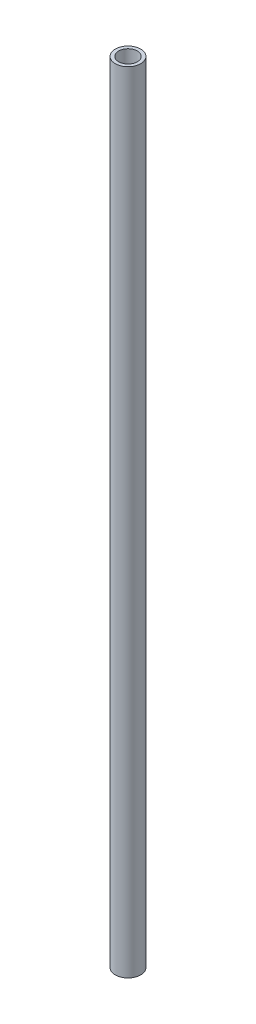
ISO-10303-21;
HEADER;
FILE_DESCRIPTION(('STEP AP214'),'2;1');
FILE_NAME('part.step','',(''),(''),'','','');
FILE_SCHEMA(('AUTOMOTIVE_DESIGN { 1 0 10303 214 1 1 1 1 }'));
ENDSEC;
DATA;
#1=APPLICATION_CONTEXT('core data for automotive mechanical design processes');
#2=APPLICATION_PROTOCOL_DEFINITION('international standard','automotive_design',2000,#1);
#3=PRODUCT_CONTEXT('',#1,'mechanical');
#4=PRODUCT('Part','Part','',(#3));
#5=PRODUCT_RELATED_PRODUCT_CATEGORY('part','',(#4));
#6=PRODUCT_DEFINITION_FORMATION('','',#4);
#7=PRODUCT_DEFINITION_CONTEXT('part definition',#1,'design');
#8=PRODUCT_DEFINITION('design','',#6,#7);
#9=PRODUCT_DEFINITION_SHAPE('','',#8);
#10=(LENGTH_UNIT() NAMED_UNIT(*) SI_UNIT(.MILLI.,.METRE.));
#11=(NAMED_UNIT(*) PLANE_ANGLE_UNIT() SI_UNIT($,.RADIAN.));
#12=(NAMED_UNIT(*) SI_UNIT($,.STERADIAN.) SOLID_ANGLE_UNIT());
#13=UNCERTAINTY_MEASURE_WITH_UNIT(LENGTH_MEASURE(1.E-05),#10,'distance_accuracy_value','');
#14=(GEOMETRIC_REPRESENTATION_CONTEXT(3) GLOBAL_UNCERTAINTY_ASSIGNED_CONTEXT((#13)) GLOBAL_UNIT_ASSIGNED_CONTEXT((#10,
#11,#12)) REPRESENTATION_CONTEXT('',''));
#15=CARTESIAN_POINT('',(0.,0.,0.));
#16=DIRECTION('',(0.,0.,1.));
#17=DIRECTION('',(1.,0.,0.));
#18=AXIS2_PLACEMENT_3D('',#15,#16,#17);
#19=CARTESIAN_POINT('',(0.,295.275,0.));
#20=DIRECTION('',(0.,1.,0.));
#21=DIRECTION('',(0.,0.,1.));
#22=AXIS2_PLACEMENT_3D('',#19,#20,#21);
#23=PLANE('',#22);
#24=CARTESIAN_POINT('',(0.,295.275,0.));
#25=DIRECTION('',(0.,1.,0.));
#26=DIRECTION('',(0.,0.,1.));
#27=AXIS2_PLACEMENT_3D('',#24,#25,#26);
#28=CIRCLE('',#27,4.7498);
#29=CARTESIAN_POINT('',(0.,295.275,4.7498));
#30=VERTEX_POINT('',#29);
#31=EDGE_CURVE('E10',#30,#30,#28,.T.);
#32=ORIENTED_EDGE('',*,*,#31,.T.);
#33=EDGE_LOOP('',(#32));
#34=FACE_BOUND('',#33,.T.);
#35=CARTESIAN_POINT('',(0.,295.275,0.));
#36=DIRECTION('',(0.,1.,0.));
#37=DIRECTION('',(0.,0.,1.));
#38=AXIS2_PLACEMENT_3D('',#35,#36,#37);
#39=CIRCLE('',#38,3.5052);
#40=CARTESIAN_POINT('',(0.,295.275,3.5052));
#41=VERTEX_POINT('',#40);
#42=EDGE_CURVE('E46',#41,#41,#39,.T.);
#43=ORIENTED_EDGE('',*,*,#42,.F.);
#44=EDGE_LOOP('',(#43));
#45=FACE_BOUND('',#44,.T.);
#46=ADVANCED_FACE('F35',(#34,#45),#23,.T.);
#47=CARTESIAN_POINT('',(0.,0.,0.));
#48=DIRECTION('',(0.,1.,0.));
#49=DIRECTION('',(0.,0.,1.));
#50=AXIS2_PLACEMENT_3D('',#47,#48,#49);
#51=PLANE('',#50);
#52=CARTESIAN_POINT('',(0.,0.,0.));
#53=DIRECTION('',(0.,1.,0.));
#54=DIRECTION('',(0.,0.,1.));
#55=AXIS2_PLACEMENT_3D('',#52,#53,#54);
#56=CIRCLE('',#55,4.7498);
#57=CARTESIAN_POINT('',(0.,0.,4.7498));
#58=VERTEX_POINT('',#57);
#59=EDGE_CURVE('E39',#58,#58,#56,.T.);
#60=ORIENTED_EDGE('',*,*,#59,.F.);
#61=EDGE_LOOP('',(#60));
#62=FACE_BOUND('',#61,.T.);
#63=CARTESIAN_POINT('',(0.,0.,0.));
#64=DIRECTION('',(0.,1.,0.));
#65=DIRECTION('',(0.,0.,1.));
#66=AXIS2_PLACEMENT_3D('',#63,#64,#65);
#67=CIRCLE('',#66,3.5052);
#68=CARTESIAN_POINT('',(0.,0.,3.5052));
#69=VERTEX_POINT('',#68);
#70=EDGE_CURVE('E48',#69,#69,#67,.T.);
#71=ORIENTED_EDGE('',*,*,#70,.T.);
#72=EDGE_LOOP('',(#71));
#73=FACE_BOUND('',#72,.T.);
#74=ADVANCED_FACE('F58',(#62,#73),#51,.F.);
#75=CARTESIAN_POINT('',(0.,295.275,0.));
#76=DIRECTION('',(0.,-1.,0.));
#77=DIRECTION('',(0.,0.,-1.));
#78=AXIS2_PLACEMENT_3D('',#75,#76,#77);
#79=CYLINDRICAL_SURFACE('',#78,4.7498);
#80=ORIENTED_EDGE('',*,*,#31,.F.);
#81=EDGE_LOOP('',(#80));
#82=FACE_BOUND('',#81,.T.);
#83=ORIENTED_EDGE('',*,*,#59,.T.);
#84=EDGE_LOOP('',(#83));
#85=FACE_BOUND('',#84,.T.);
#86=ADVANCED_FACE('F37',(#82,#85),#79,.T.);
#87=CARTESIAN_POINT('',(0.,295.275,0.));
#88=DIRECTION('',(0.,-1.,0.));
#89=DIRECTION('',(0.,0.,-1.));
#90=AXIS2_PLACEMENT_3D('',#87,#88,#89);
#91=CYLINDRICAL_SURFACE('',#90,3.5052);
#92=ORIENTED_EDGE('',*,*,#42,.T.);
#93=EDGE_LOOP('',(#92));
#94=FACE_BOUND('',#93,.T.);
#95=ORIENTED_EDGE('',*,*,#70,.F.);
#96=EDGE_LOOP('',(#95));
#97=FACE_BOUND('',#96,.T.);
#98=ADVANCED_FACE('F54',(#94,#97),#91,.F.);
#99=CLOSED_SHELL('',(#46,#74,#86,#98));
#100=MANIFOLD_SOLID_BREP('B2',#99);
#101=ADVANCED_BREP_SHAPE_REPRESENTATION('',(#18,#100),#14);
#102=SHAPE_DEFINITION_REPRESENTATION(#9,#101);
ENDSEC;
END-ISO-10303-21;
